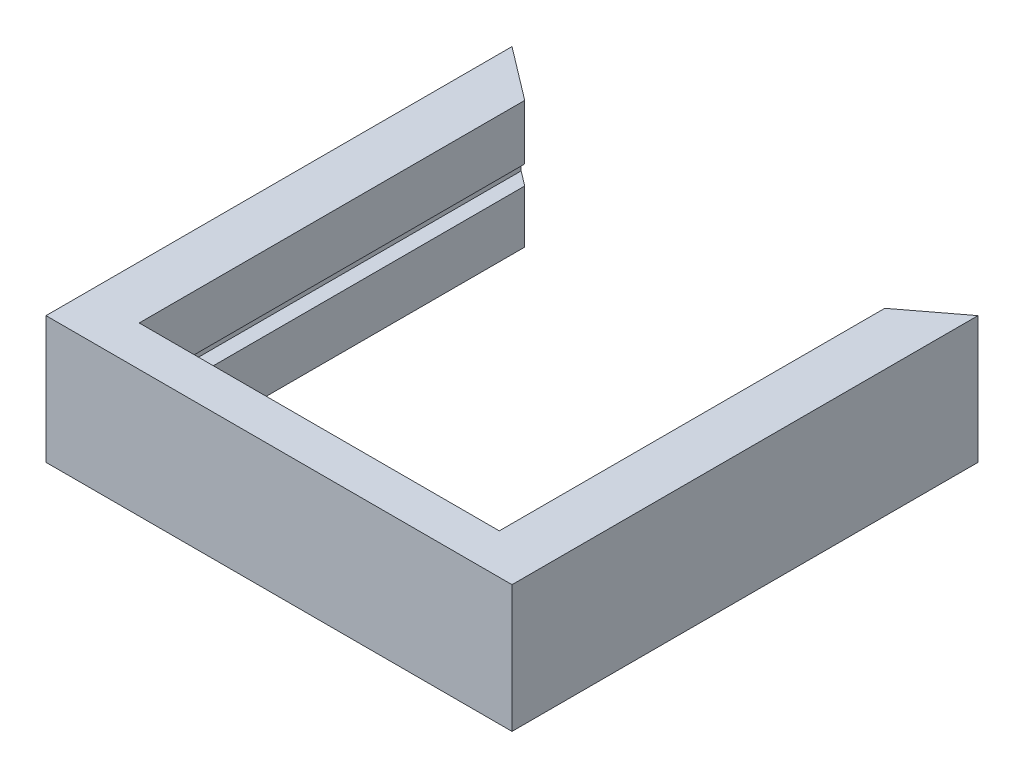
ISO-10303-21;
HEADER;
FILE_DESCRIPTION(('STEP AP214'),'2;1');
FILE_NAME('part.step','',(''),(''),'','','');
FILE_SCHEMA(('AUTOMOTIVE_DESIGN { 1 0 10303 214 1 1 1 1 }'));
ENDSEC;
DATA;
#1=APPLICATION_CONTEXT('core data for automotive mechanical design processes');
#2=APPLICATION_PROTOCOL_DEFINITION('international standard','automotive_design',2000,#1);
#3=PRODUCT_CONTEXT('',#1,'mechanical');
#4=PRODUCT('Part','Part','',(#3));
#5=PRODUCT_RELATED_PRODUCT_CATEGORY('part','',(#4));
#6=PRODUCT_DEFINITION_FORMATION('','',#4);
#7=PRODUCT_DEFINITION_CONTEXT('part definition',#1,'design');
#8=PRODUCT_DEFINITION('design','',#6,#7);
#9=PRODUCT_DEFINITION_SHAPE('','',#8);
#10=(LENGTH_UNIT() NAMED_UNIT(*) SI_UNIT(.MILLI.,.METRE.));
#11=(NAMED_UNIT(*) PLANE_ANGLE_UNIT() SI_UNIT($,.RADIAN.));
#12=(NAMED_UNIT(*) SI_UNIT($,.STERADIAN.) SOLID_ANGLE_UNIT());
#13=UNCERTAINTY_MEASURE_WITH_UNIT(LENGTH_MEASURE(1.E-05),#10,'distance_accuracy_value','');
#14=(GEOMETRIC_REPRESENTATION_CONTEXT(3) GLOBAL_UNCERTAINTY_ASSIGNED_CONTEXT((#13)) GLOBAL_UNIT_ASSIGNED_CONTEXT((#10,
#11,#12)) REPRESENTATION_CONTEXT('',''));
#15=CARTESIAN_POINT('',(0.,0.,0.));
#16=DIRECTION('',(0.,0.,1.));
#17=DIRECTION('',(1.,0.,0.));
#18=AXIS2_PLACEMENT_3D('',#15,#16,#17);
#19=CARTESIAN_POINT('',(55.,30.,-55.));
#20=DIRECTION('',(0.605083267533558,0.,0.796162194123102));
#21=DIRECTION('',(0.796162194123102,0.,-0.605083267533559));
#22=AXIS2_PLACEMENT_3D('',#19,#20,#21);
#23=PLANE('',#22);
#24=DIRECTION('',(0.,-1.,0.));
#25=VECTOR('',#24,1.);
#26=CARTESIAN_POINT('',(46.,30.,-48.16));
#27=LINE('',#26,#25);
#28=CARTESIAN_POINT('',(46.,13.5,-48.16));
#29=VERTEX_POINT('',#28);
#30=CARTESIAN_POINT('',(46.,12.5,-48.16));
#31=VERTEX_POINT('',#30);
#32=EDGE_CURVE('E172',#29,#31,#27,.T.);
#33=ORIENTED_EDGE('',*,*,#32,.F.);
#34=DIRECTION('',(0.622862577293282,-0.622862577293276,-0.473375558742895));
#35=VECTOR('',#34,1.);
#36=CARTESIAN_POINT('',(45.1070763500932,14.3929236499068,-47.4813780260708));
#37=LINE('',#36,#35);
#38=CARTESIAN_POINT('',(42.5,16.9999999999999,-45.5));
#39=VERTEX_POINT('',#38);
#40=EDGE_CURVE('E11',#29,#39,#37,.F.);
#41=ORIENTED_EDGE('',*,*,#40,.T.);
#42=DIRECTION('',(0.,-1.,0.));
#43=VECTOR('',#42,1.);
#44=CARTESIAN_POINT('',(42.5,30.,-45.5));
#45=LINE('',#44,#43);
#46=CARTESIAN_POINT('',(42.5,30.,-45.5));
#47=VERTEX_POINT('',#46);
#48=EDGE_CURVE('E48',#47,#39,#45,.T.);
#49=ORIENTED_EDGE('',*,*,#48,.F.);
#50=DIRECTION('',(-0.796162194123102,0.,0.605083267533559));
#51=VECTOR('',#50,1.);
#52=CARTESIAN_POINT('',(55.,30.,-55.));
#53=LINE('',#52,#51);
#54=CARTESIAN_POINT('',(55.,30.,-55.));
#55=VERTEX_POINT('',#54);
#56=EDGE_CURVE('E192',#55,#47,#53,.T.);
#57=ORIENTED_EDGE('',*,*,#56,.F.);
#58=DIRECTION('',(0.,-1.,0.));
#59=VECTOR('',#58,1.);
#60=CARTESIAN_POINT('',(55.,30.,-55.));
#61=LINE('',#60,#59);
#62=CARTESIAN_POINT('',(55.,0.,-55.));
#63=VERTEX_POINT('',#62);
#64=EDGE_CURVE('E210',#55,#63,#61,.T.);
#65=ORIENTED_EDGE('',*,*,#64,.T.);
#66=DIRECTION('',(-0.796162194123102,0.,0.605083267533559));
#67=VECTOR('',#66,1.);
#68=CARTESIAN_POINT('',(55.,0.,-55.));
#69=LINE('',#68,#67);
#70=CARTESIAN_POINT('',(42.5,0.,-45.5));
#71=VERTEX_POINT('',#70);
#72=EDGE_CURVE('E191',#63,#71,#69,.T.);
#73=ORIENTED_EDGE('',*,*,#72,.T.);
#74=CARTESIAN_POINT('',(42.5,12.5,-45.5));
#75=VERTEX_POINT('',#74);
#76=EDGE_CURVE('E246',#75,#71,#45,.T.);
#77=ORIENTED_EDGE('',*,*,#76,.F.);
#78=DIRECTION('',(-0.796162194123102,0.,0.605083267533559));
#79=VECTOR('',#78,1.);
#80=CARTESIAN_POINT('',(55.,12.5,-55.));
#81=LINE('',#80,#79);
#82=EDGE_CURVE('E189',#31,#75,#81,.T.);
#83=ORIENTED_EDGE('',*,*,#82,.F.);
#84=EDGE_LOOP('',(#33,#41,#49,#57,#65,#73,#77,#83));
#85=FACE_BOUND('',#84,.T.);
#86=ADVANCED_FACE('F33',(#85),#23,.F.);
#87=CARTESIAN_POINT('',(42.5,30.,45.5));
#88=DIRECTION('',(1.,0.,0.));
#89=DIRECTION('',(0.,0.,-1.));
#90=AXIS2_PLACEMENT_3D('',#87,#88,#89);
#91=PLANE('',#90);
#92=ORIENTED_EDGE('',*,*,#48,.T.);
#93=DIRECTION('',(0.,0.,-1.));
#94=VECTOR('',#93,1.);
#95=CARTESIAN_POINT('',(42.5,16.9999999999999,45.5));
#96=LINE('',#95,#94);
#97=CARTESIAN_POINT('',(42.5,16.9999999999999,45.5));
#98=VERTEX_POINT('',#97);
#99=EDGE_CURVE('E41',#39,#98,#96,.F.);
#100=ORIENTED_EDGE('',*,*,#99,.T.);
#101=DIRECTION('',(0.,-1.,0.));
#102=VECTOR('',#101,1.);
#103=CARTESIAN_POINT('',(42.5,30.,45.5));
#104=LINE('',#103,#102);
#105=CARTESIAN_POINT('',(42.5,30.,45.5));
#106=VERTEX_POINT('',#105);
#107=EDGE_CURVE('E75',#106,#98,#104,.T.);
#108=ORIENTED_EDGE('',*,*,#107,.F.);
#109=DIRECTION('',(0.,0.,1.));
#110=VECTOR('',#109,1.);
#111=CARTESIAN_POINT('',(42.5,30.,45.5));
#112=LINE('',#111,#110);
#113=EDGE_CURVE('E195',#47,#106,#112,.T.);
#114=ORIENTED_EDGE('',*,*,#113,.F.);
#115=EDGE_LOOP('',(#92,#100,#108,#114));
#116=FACE_BOUND('',#115,.T.);
#117=ADVANCED_FACE('F266',(#116),#91,.F.);
#118=DIRECTION('',(0.,0.,1.));
#119=VECTOR('',#118,1.);
#120=CARTESIAN_POINT('',(42.5,12.5,45.5));
#121=LINE('',#120,#119);
#122=CARTESIAN_POINT('',(42.5,12.5,45.5));
#123=VERTEX_POINT('',#122);
#124=EDGE_CURVE('E180',#75,#123,#121,.T.);
#125=ORIENTED_EDGE('',*,*,#124,.F.);
#126=ORIENTED_EDGE('',*,*,#76,.T.);
#127=DIRECTION('',(0.,0.,1.));
#128=VECTOR('',#127,1.);
#129=CARTESIAN_POINT('',(42.5,0.,45.5));
#130=LINE('',#129,#128);
#131=CARTESIAN_POINT('',(42.5,0.,45.5));
#132=VERTEX_POINT('',#131);
#133=EDGE_CURVE('E213',#71,#132,#130,.T.);
#134=ORIENTED_EDGE('',*,*,#133,.T.);
#135=EDGE_CURVE('E244',#123,#132,#104,.T.);
#136=ORIENTED_EDGE('',*,*,#135,.F.);
#137=EDGE_LOOP('',(#125,#126,#134,#136));
#138=FACE_BOUND('',#137,.T.);
#139=ADVANCED_FACE('F271',(#138),#91,.F.);
#140=CARTESIAN_POINT('',(-42.5,30.,45.5));
#141=DIRECTION('',(-1.,0.,0.));
#142=DIRECTION('',(0.,0.,1.));
#143=AXIS2_PLACEMENT_3D('',#140,#141,#142);
#144=PLANE('',#143);
#145=DIRECTION('',(0.,-1.,0.));
#146=VECTOR('',#145,1.);
#147=CARTESIAN_POINT('',(-42.5,30.,45.5));
#148=LINE('',#147,#146);
#149=CARTESIAN_POINT('',(-42.5,30.,45.5));
#150=VERTEX_POINT('',#149);
#151=CARTESIAN_POINT('',(-42.5,16.9999999999999,45.5));
#152=VERTEX_POINT('',#151);
#153=EDGE_CURVE('E67',#150,#152,#148,.T.);
#154=ORIENTED_EDGE('',*,*,#153,.T.);
#155=DIRECTION('',(0.,0.,1.));
#156=VECTOR('',#155,1.);
#157=CARTESIAN_POINT('',(-42.5,16.9999999999999,45.5));
#158=LINE('',#157,#156);
#159=CARTESIAN_POINT('',(-42.5,16.9999999999999,-45.5));
#160=VERTEX_POINT('',#159);
#161=EDGE_CURVE('E262',#152,#160,#158,.F.);
#162=ORIENTED_EDGE('',*,*,#161,.T.);
#163=DIRECTION('',(0.,-1.,0.));
#164=VECTOR('',#163,1.);
#165=CARTESIAN_POINT('',(-42.5,30.,-45.5));
#166=LINE('',#165,#164);
#167=CARTESIAN_POINT('',(-42.5,30.,-45.5));
#168=VERTEX_POINT('',#167);
#169=EDGE_CURVE('E56',#168,#160,#166,.T.);
#170=ORIENTED_EDGE('',*,*,#169,.F.);
#171=DIRECTION('',(0.,0.,-1.));
#172=VECTOR('',#171,1.);
#173=CARTESIAN_POINT('',(-42.5,30.,45.5));
#174=LINE('',#173,#172);
#175=EDGE_CURVE('E200',#150,#168,#174,.T.);
#176=ORIENTED_EDGE('',*,*,#175,.F.);
#177=EDGE_LOOP('',(#154,#162,#170,#176));
#178=FACE_BOUND('',#177,.T.);
#179=ADVANCED_FACE('F300',(#178),#144,.F.);
#180=DIRECTION('',(0.,0.,-1.));
#181=VECTOR('',#180,1.);
#182=CARTESIAN_POINT('',(-42.5,12.5,45.5));
#183=LINE('',#182,#181);
#184=CARTESIAN_POINT('',(-42.5,12.5,45.5));
#185=VERTEX_POINT('',#184);
#186=CARTESIAN_POINT('',(-42.5,12.5,-45.5));
#187=VERTEX_POINT('',#186);
#188=EDGE_CURVE('E175',#185,#187,#183,.T.);
#189=ORIENTED_EDGE('',*,*,#188,.F.);
#190=CARTESIAN_POINT('',(-42.5,0.,45.5));
#191=VERTEX_POINT('',#190);
#192=EDGE_CURVE('E242',#185,#191,#148,.T.);
#193=ORIENTED_EDGE('',*,*,#192,.T.);
#194=DIRECTION('',(0.,0.,-1.));
#195=VECTOR('',#194,1.);
#196=CARTESIAN_POINT('',(-42.5,0.,45.5));
#197=LINE('',#196,#195);
#198=CARTESIAN_POINT('',(-42.5,0.,-45.5));
#199=VERTEX_POINT('',#198);
#200=EDGE_CURVE('E219',#191,#199,#197,.T.);
#201=ORIENTED_EDGE('',*,*,#200,.T.);
#202=EDGE_CURVE('E240',#187,#199,#166,.T.);
#203=ORIENTED_EDGE('',*,*,#202,.F.);
#204=EDGE_LOOP('',(#189,#193,#201,#203));
#205=FACE_BOUND('',#204,.T.);
#206=ADVANCED_FACE('F284',(#205),#144,.F.);
#207=CARTESIAN_POINT('',(-55.,30.,-55.));
#208=DIRECTION('',(-0.605083267533559,0.,0.796162194123102));
#209=DIRECTION('',(0.796162194123102,0.,0.605083267533559));
#210=AXIS2_PLACEMENT_3D('',#207,#208,#209);
#211=PLANE('',#210);
#212=ORIENTED_EDGE('',*,*,#169,.T.);
#213=DIRECTION('',(0.622862577293278,0.622862577293281,0.473375558742893));
#214=VECTOR('',#213,1.);
#215=CARTESIAN_POINT('',(-45.1070763500931,14.3929236499069,-47.4813780260707));
#216=LINE('',#215,#214);
#217=CARTESIAN_POINT('',(-46.,13.4999999999999,-48.16));
#218=VERTEX_POINT('',#217);
#219=EDGE_CURVE('E264',#160,#218,#216,.F.);
#220=ORIENTED_EDGE('',*,*,#219,.T.);
#221=DIRECTION('',(0.,1.,0.));
#222=VECTOR('',#221,1.);
#223=CARTESIAN_POINT('',(-46.,30.,-48.16));
#224=LINE('',#223,#222);
#225=CARTESIAN_POINT('',(-46.,12.5,-48.16));
#226=VERTEX_POINT('',#225);
#227=EDGE_CURVE('E250',#226,#218,#224,.T.);
#228=ORIENTED_EDGE('',*,*,#227,.F.);
#229=DIRECTION('',(-0.796162194123102,0.,-0.605083267533559));
#230=VECTOR('',#229,1.);
#231=CARTESIAN_POINT('',(-55.,12.5,-55.));
#232=LINE('',#231,#230);
#233=EDGE_CURVE('E248',#187,#226,#232,.T.);
#234=ORIENTED_EDGE('',*,*,#233,.F.);
#235=ORIENTED_EDGE('',*,*,#202,.T.);
#236=DIRECTION('',(-0.796162194123101,0.,-0.605083267533559));
#237=VECTOR('',#236,1.);
#238=CARTESIAN_POINT('',(-55.,0.,-55.));
#239=LINE('',#238,#237);
#240=CARTESIAN_POINT('',(-55.,0.,-55.));
#241=VERTEX_POINT('',#240);
#242=EDGE_CURVE('E222',#199,#241,#239,.T.);
#243=ORIENTED_EDGE('',*,*,#242,.T.);
#244=DIRECTION('',(0.,-1.,0.));
#245=VECTOR('',#244,1.);
#246=CARTESIAN_POINT('',(-55.,30.,-55.));
#247=LINE('',#246,#245);
#248=CARTESIAN_POINT('',(-55.,30.,-55.));
#249=VERTEX_POINT('',#248);
#250=EDGE_CURVE('E237',#249,#241,#247,.T.);
#251=ORIENTED_EDGE('',*,*,#250,.F.);
#252=DIRECTION('',(-0.796162194123101,0.,-0.605083267533559));
#253=VECTOR('',#252,1.);
#254=CARTESIAN_POINT('',(-55.,30.,-55.));
#255=LINE('',#254,#253);
#256=EDGE_CURVE('E202',#168,#249,#255,.T.);
#257=ORIENTED_EDGE('',*,*,#256,.F.);
#258=EDGE_LOOP('',(#212,#220,#228,#234,#235,#243,#251,#257));
#259=FACE_BOUND('',#258,.T.);
#260=ADVANCED_FACE('F290',(#259),#211,.F.);
#261=CARTESIAN_POINT('',(-42.5,30.,45.5));
#262=DIRECTION('',(0.,0.,1.));
#263=DIRECTION('',(1.,0.,0.));
#264=AXIS2_PLACEMENT_3D('',#261,#262,#263);
#265=PLANE('',#264);
#266=DIRECTION('',(-0.707106781186546,-0.70710678118655,0.));
#267=VECTOR('',#266,1.);
#268=CARTESIAN_POINT('',(-46.,13.4999999999999,45.5));
#269=LINE('',#268,#267);
#270=CARTESIAN_POINT('',(-46.,13.4999999999999,45.5));
#271=VERTEX_POINT('',#270);
#272=EDGE_CURVE('E258',#271,#152,#269,.F.);
#273=ORIENTED_EDGE('',*,*,#272,.T.);
#274=ORIENTED_EDGE('',*,*,#153,.F.);
#275=DIRECTION('',(-1.,0.,0.));
#276=VECTOR('',#275,1.);
#277=CARTESIAN_POINT('',(-42.5,30.,45.5));
#278=LINE('',#277,#276);
#279=EDGE_CURVE('E198',#106,#150,#278,.T.);
#280=ORIENTED_EDGE('',*,*,#279,.F.);
#281=ORIENTED_EDGE('',*,*,#107,.T.);
#282=DIRECTION('',(-0.707106781186551,0.707106781186544,0.));
#283=VECTOR('',#282,1.);
#284=CARTESIAN_POINT('',(41.9999999999999,17.5,45.5));
#285=LINE('',#284,#283);
#286=CARTESIAN_POINT('',(46.,13.5,45.5));
#287=VERTEX_POINT('',#286);
#288=EDGE_CURVE('E161',#98,#287,#285,.F.);
#289=ORIENTED_EDGE('',*,*,#288,.T.);
#290=DIRECTION('',(0.,-1.,0.));
#291=VECTOR('',#290,1.);
#292=CARTESIAN_POINT('',(46.,12.5,45.5));
#293=LINE('',#292,#291);
#294=CARTESIAN_POINT('',(46.,12.5,45.5));
#295=VERTEX_POINT('',#294);
#296=EDGE_CURVE('E154',#287,#295,#293,.T.);
#297=ORIENTED_EDGE('',*,*,#296,.T.);
#298=DIRECTION('',(-1.,0.,0.));
#299=VECTOR('',#298,1.);
#300=CARTESIAN_POINT('',(46.,12.5,45.5));
#301=LINE('',#300,#299);
#302=EDGE_CURVE('E158',#295,#123,#301,.T.);
#303=ORIENTED_EDGE('',*,*,#302,.T.);
#304=ORIENTED_EDGE('',*,*,#135,.T.);
#305=DIRECTION('',(-1.,0.,0.));
#306=VECTOR('',#305,1.);
#307=CARTESIAN_POINT('',(-42.5,0.,45.5));
#308=LINE('',#307,#306);
#309=EDGE_CURVE('E216',#132,#191,#308,.T.);
#310=ORIENTED_EDGE('',*,*,#309,.T.);
#311=ORIENTED_EDGE('',*,*,#192,.F.);
#312=CARTESIAN_POINT('',(-46.,12.5,45.5));
#313=VERTEX_POINT('',#312);
#314=EDGE_CURVE('E165',#185,#313,#301,.T.);
#315=ORIENTED_EDGE('',*,*,#314,.T.);
#316=DIRECTION('',(0.,1.,0.));
#317=VECTOR('',#316,1.);
#318=CARTESIAN_POINT('',(-46.,12.5,45.5));
#319=LINE('',#318,#317);
#320=EDGE_CURVE('E166',#313,#271,#319,.T.);
#321=ORIENTED_EDGE('',*,*,#320,.T.);
#322=EDGE_LOOP('',(#273,#274,#280,#281,#289,#297,#303,#304,#310,#311,#315,#321));
#323=FACE_BOUND('',#322,.T.);
#324=ADVANCED_FACE('F156',(#323),#265,.F.);
#325=CARTESIAN_POINT('',(-55.,30.,55.));
#326=DIRECTION('',(1.,0.,0.));
#327=DIRECTION('',(0.,0.,-1.));
#328=AXIS2_PLACEMENT_3D('',#325,#326,#327);
#329=PLANE('',#328);
#330=DIRECTION('',(0.,0.,1.));
#331=VECTOR('',#330,1.);
#332=CARTESIAN_POINT('',(-55.,0.,55.));
#333=LINE('',#332,#331);
#334=CARTESIAN_POINT('',(-55.,0.,55.));
#335=VERTEX_POINT('',#334);
#336=EDGE_CURVE('E224',#241,#335,#333,.T.);
#337=ORIENTED_EDGE('',*,*,#336,.T.);
#338=DIRECTION('',(0.,-1.,0.));
#339=VECTOR('',#338,1.);
#340=CARTESIAN_POINT('',(-55.,30.,55.));
#341=LINE('',#340,#339);
#342=CARTESIAN_POINT('',(-55.,30.,55.));
#343=VERTEX_POINT('',#342);
#344=EDGE_CURVE('E234',#343,#335,#341,.T.);
#345=ORIENTED_EDGE('',*,*,#344,.F.);
#346=DIRECTION('',(0.,0.,1.));
#347=VECTOR('',#346,1.);
#348=CARTESIAN_POINT('',(-55.,30.,55.));
#349=LINE('',#348,#347);
#350=EDGE_CURVE('E204',#249,#343,#349,.T.);
#351=ORIENTED_EDGE('',*,*,#350,.F.);
#352=ORIENTED_EDGE('',*,*,#250,.T.);
#353=EDGE_LOOP('',(#337,#345,#351,#352));
#354=FACE_BOUND('',#353,.T.);
#355=ADVANCED_FACE('F318',(#354),#329,.F.);
#356=CARTESIAN_POINT('',(-55.,30.,55.));
#357=DIRECTION('',(0.,0.,-1.));
#358=DIRECTION('',(-1.,0.,0.));
#359=AXIS2_PLACEMENT_3D('',#356,#357,#358);
#360=PLANE('',#359);
#361=DIRECTION('',(1.,0.,0.));
#362=VECTOR('',#361,1.);
#363=CARTESIAN_POINT('',(-55.,0.,55.));
#364=LINE('',#363,#362);
#365=CARTESIAN_POINT('',(55.,0.,55.));
#366=VERTEX_POINT('',#365);
#367=EDGE_CURVE('E226',#335,#366,#364,.T.);
#368=ORIENTED_EDGE('',*,*,#367,.T.);
#369=DIRECTION('',(0.,-1.,0.));
#370=VECTOR('',#369,1.);
#371=CARTESIAN_POINT('',(55.,30.,55.));
#372=LINE('',#371,#370);
#373=CARTESIAN_POINT('',(55.,30.,55.));
#374=VERTEX_POINT('',#373);
#375=EDGE_CURVE('E231',#374,#366,#372,.T.);
#376=ORIENTED_EDGE('',*,*,#375,.F.);
#377=DIRECTION('',(1.,0.,0.));
#378=VECTOR('',#377,1.);
#379=CARTESIAN_POINT('',(-55.,30.,55.));
#380=LINE('',#379,#378);
#381=EDGE_CURVE('E206',#343,#374,#380,.T.);
#382=ORIENTED_EDGE('',*,*,#381,.F.);
#383=ORIENTED_EDGE('',*,*,#344,.T.);
#384=EDGE_LOOP('',(#368,#376,#382,#383));
#385=FACE_BOUND('',#384,.T.);
#386=ADVANCED_FACE('F314',(#385),#360,.F.);
#387=CARTESIAN_POINT('',(55.,30.,55.));
#388=DIRECTION('',(-1.,0.,0.));
#389=DIRECTION('',(0.,0.,1.));
#390=AXIS2_PLACEMENT_3D('',#387,#388,#389);
#391=PLANE('',#390);
#392=DIRECTION('',(0.,0.,-1.));
#393=VECTOR('',#392,1.);
#394=CARTESIAN_POINT('',(55.,0.,55.));
#395=LINE('',#394,#393);
#396=EDGE_CURVE('E196',#366,#63,#395,.T.);
#397=ORIENTED_EDGE('',*,*,#396,.T.);
#398=ORIENTED_EDGE('',*,*,#64,.F.);
#399=DIRECTION('',(0.,0.,-1.));
#400=VECTOR('',#399,1.);
#401=CARTESIAN_POINT('',(55.,30.,55.));
#402=LINE('',#401,#400);
#403=EDGE_CURVE('E208',#374,#55,#402,.T.);
#404=ORIENTED_EDGE('',*,*,#403,.F.);
#405=ORIENTED_EDGE('',*,*,#375,.T.);
#406=EDGE_LOOP('',(#397,#398,#404,#405));
#407=FACE_BOUND('',#406,.T.);
#408=ADVANCED_FACE('F310',(#407),#391,.F.);
#409=CARTESIAN_POINT('',(0.,30.,0.));
#410=DIRECTION('',(0.,1.,0.));
#411=DIRECTION('',(0.,0.,1.));
#412=AXIS2_PLACEMENT_3D('',#409,#410,#411);
#413=PLANE('',#412);
#414=ORIENTED_EDGE('',*,*,#56,.T.);
#415=ORIENTED_EDGE('',*,*,#113,.T.);
#416=ORIENTED_EDGE('',*,*,#279,.T.);
#417=ORIENTED_EDGE('',*,*,#175,.T.);
#418=ORIENTED_EDGE('',*,*,#256,.T.);
#419=ORIENTED_EDGE('',*,*,#350,.T.);
#420=ORIENTED_EDGE('',*,*,#381,.T.);
#421=ORIENTED_EDGE('',*,*,#403,.T.);
#422=EDGE_LOOP('',(#414,#415,#416,#417,#418,#419,#420,#421));
#423=FACE_BOUND('',#422,.T.);
#424=ADVANCED_FACE('F302',(#423),#413,.T.);
#425=CARTESIAN_POINT('',(0.,0.,0.));
#426=DIRECTION('',(0.,1.,0.));
#427=DIRECTION('',(0.,0.,1.));
#428=AXIS2_PLACEMENT_3D('',#425,#426,#427);
#429=PLANE('',#428);
#430=ORIENTED_EDGE('',*,*,#72,.F.);
#431=ORIENTED_EDGE('',*,*,#396,.F.);
#432=ORIENTED_EDGE('',*,*,#367,.F.);
#433=ORIENTED_EDGE('',*,*,#336,.F.);
#434=ORIENTED_EDGE('',*,*,#242,.F.);
#435=ORIENTED_EDGE('',*,*,#200,.F.);
#436=ORIENTED_EDGE('',*,*,#309,.F.);
#437=ORIENTED_EDGE('',*,*,#133,.F.);
#438=EDGE_LOOP('',(#430,#431,#432,#433,#434,#435,#436,#437));
#439=FACE_BOUND('',#438,.T.);
#440=ADVANCED_FACE('F279',(#439),#429,.F.);
#441=CARTESIAN_POINT('',(46.,12.5,-55.));
#442=DIRECTION('',(0.,1.,0.));
#443=DIRECTION('',(-1.,0.,0.));
#444=AXIS2_PLACEMENT_3D('',#441,#442,#443);
#445=PLANE('',#444);
#446=ORIENTED_EDGE('',*,*,#188,.T.);
#447=ORIENTED_EDGE('',*,*,#233,.T.);
#448=DIRECTION('',(0.,0.,1.));
#449=VECTOR('',#448,1.);
#450=CARTESIAN_POINT('',(-46.,12.5,-55.));
#451=LINE('',#450,#449);
#452=EDGE_CURVE('E176',#226,#313,#451,.T.);
#453=ORIENTED_EDGE('',*,*,#452,.T.);
#454=ORIENTED_EDGE('',*,*,#314,.F.);
#455=EDGE_LOOP('',(#446,#447,#453,#454));
#456=FACE_BOUND('',#455,.T.);
#457=ADVANCED_FACE('F287',(#456),#445,.T.);
#458=CARTESIAN_POINT('',(-46.,12.5,-55.));
#459=DIRECTION('',(1.,0.,0.));
#460=DIRECTION('',(0.,0.,-1.));
#461=AXIS2_PLACEMENT_3D('',#458,#459,#460);
#462=PLANE('',#461);
#463=ORIENTED_EDGE('',*,*,#227,.T.);
#464=DIRECTION('',(0.,0.,1.));
#465=VECTOR('',#464,1.);
#466=CARTESIAN_POINT('',(-46.,13.4999999999999,45.5));
#467=LINE('',#466,#465);
#468=EDGE_CURVE('E254',#218,#271,#467,.T.);
#469=ORIENTED_EDGE('',*,*,#468,.T.);
#470=ORIENTED_EDGE('',*,*,#320,.F.);
#471=ORIENTED_EDGE('',*,*,#452,.F.);
#472=EDGE_LOOP('',(#463,#469,#470,#471));
#473=FACE_BOUND('',#472,.T.);
#474=ADVANCED_FACE('F294',(#473),#462,.T.);
#475=CARTESIAN_POINT('',(46.,12.5,-55.));
#476=DIRECTION('',(-1.,0.,0.));
#477=DIRECTION('',(0.,0.,1.));
#478=AXIS2_PLACEMENT_3D('',#475,#476,#477);
#479=PLANE('',#478);
#480=ORIENTED_EDGE('',*,*,#296,.F.);
#481=DIRECTION('',(0.,0.,-1.));
#482=VECTOR('',#481,1.);
#483=CARTESIAN_POINT('',(46.,13.5,-48.16));
#484=LINE('',#483,#482);
#485=EDGE_CURVE('E260',#287,#29,#484,.T.);
#486=ORIENTED_EDGE('',*,*,#485,.T.);
#487=ORIENTED_EDGE('',*,*,#32,.T.);
#488=DIRECTION('',(0.,0.,1.));
#489=VECTOR('',#488,1.);
#490=CARTESIAN_POINT('',(46.,12.5,-55.));
#491=LINE('',#490,#489);
#492=EDGE_CURVE('E169',#31,#295,#491,.T.);
#493=ORIENTED_EDGE('',*,*,#492,.T.);
#494=EDGE_LOOP('',(#480,#486,#487,#493));
#495=FACE_BOUND('',#494,.T.);
#496=ADVANCED_FACE('F170',(#495),#479,.T.);
#497=ORIENTED_EDGE('',*,*,#82,.T.);
#498=ORIENTED_EDGE('',*,*,#124,.T.);
#499=ORIENTED_EDGE('',*,*,#302,.F.);
#500=ORIENTED_EDGE('',*,*,#492,.F.);
#501=EDGE_LOOP('',(#497,#498,#499,#500));
#502=FACE_BOUND('',#501,.T.);
#503=ADVANCED_FACE('F178',(#502),#445,.T.);
#504=CARTESIAN_POINT('',(-46.,13.4999999999999,-55.));
#505=DIRECTION('',(0.70710678118655,-0.707106781186546,0.));
#506=DIRECTION('',(0.,0.,-1.));
#507=AXIS2_PLACEMENT_3D('',#504,#505,#506);
#508=PLANE('',#507);
#509=ORIENTED_EDGE('',*,*,#219,.F.);
#510=ORIENTED_EDGE('',*,*,#161,.F.);
#511=ORIENTED_EDGE('',*,*,#272,.F.);
#512=ORIENTED_EDGE('',*,*,#468,.F.);
#513=EDGE_LOOP('',(#509,#510,#511,#512));
#514=FACE_BOUND('',#513,.T.);
#515=ADVANCED_FACE('F298',(#514),#508,.T.);
#516=CARTESIAN_POINT('',(41.9999999999999,17.5,-55.));
#517=DIRECTION('',(-0.707106781186544,-0.707106781186551,0.));
#518=DIRECTION('',(0.,0.,-1.));
#519=AXIS2_PLACEMENT_3D('',#516,#517,#518);
#520=PLANE('',#519);
#521=ORIENTED_EDGE('',*,*,#40,.F.);
#522=ORIENTED_EDGE('',*,*,#485,.F.);
#523=ORIENTED_EDGE('',*,*,#288,.F.);
#524=ORIENTED_EDGE('',*,*,#99,.F.);
#525=EDGE_LOOP('',(#521,#522,#523,#524));
#526=FACE_BOUND('',#525,.T.);
#527=ADVANCED_FACE('F35',(#526),#520,.T.);
#528=CLOSED_SHELL('',(#86,#117,#139,#179,#206,#260,#324,#355,#386,#408,#424,#440,#457,#474,#496,
#503,#515,#527));
#529=MANIFOLD_SOLID_BREP('B2',#528);
#530=ADVANCED_BREP_SHAPE_REPRESENTATION('',(#18,#529),#14);
#531=SHAPE_DEFINITION_REPRESENTATION(#9,#530);
ENDSEC;
END-ISO-10303-21;
